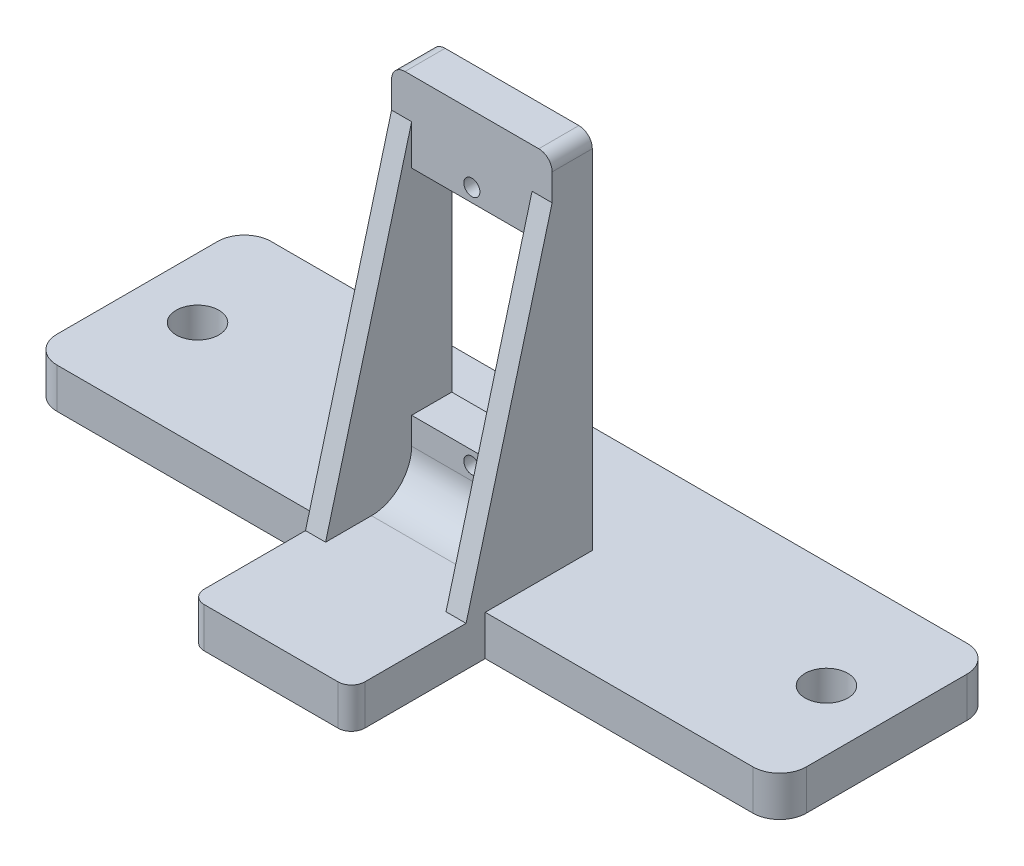
ISO-10303-21;
HEADER;
FILE_DESCRIPTION(('STEP AP214'),'2;1');
FILE_NAME('part.step','',(''),(''),'','','');
FILE_SCHEMA(('AUTOMOTIVE_DESIGN { 1 0 10303 214 1 1 1 1 }'));
ENDSEC;
DATA;
#1=APPLICATION_CONTEXT('core data for automotive mechanical design processes');
#2=APPLICATION_PROTOCOL_DEFINITION('international standard','automotive_design',2000,#1);
#3=PRODUCT_CONTEXT('',#1,'mechanical');
#4=PRODUCT('Part','Part','',(#3));
#5=PRODUCT_RELATED_PRODUCT_CATEGORY('part','',(#4));
#6=PRODUCT_DEFINITION_FORMATION('','',#4);
#7=PRODUCT_DEFINITION_CONTEXT('part definition',#1,'design');
#8=PRODUCT_DEFINITION('design','',#6,#7);
#9=PRODUCT_DEFINITION_SHAPE('','',#8);
#10=(LENGTH_UNIT() NAMED_UNIT(*) SI_UNIT(.MILLI.,.METRE.));
#11=(NAMED_UNIT(*) PLANE_ANGLE_UNIT() SI_UNIT($,.RADIAN.));
#12=(NAMED_UNIT(*) SI_UNIT($,.STERADIAN.) SOLID_ANGLE_UNIT());
#13=UNCERTAINTY_MEASURE_WITH_UNIT(LENGTH_MEASURE(1.E-05),#10,'distance_accuracy_value','');
#14=(GEOMETRIC_REPRESENTATION_CONTEXT(3) GLOBAL_UNCERTAINTY_ASSIGNED_CONTEXT((#13)) GLOBAL_UNIT_ASSIGNED_CONTEXT((#10,
#11,#12)) REPRESENTATION_CONTEXT('',''));
#15=CARTESIAN_POINT('',(0.,0.,0.));
#16=DIRECTION('',(0.,0.,1.));
#17=DIRECTION('',(1.,0.,0.));
#18=AXIS2_PLACEMENT_3D('',#15,#16,#17);
#19=CARTESIAN_POINT('',(5.,29.,3.));
#20=DIRECTION('',(0.,0.,1.));
#21=DIRECTION('',(1.,0.,0.));
#22=AXIS2_PLACEMENT_3D('',#19,#20,#21);
#23=PLANE('',#22);
#24=CARTESIAN_POINT('',(0.,7.,3.));
#25=DIRECTION('',(0.,0.,1.));
#26=DIRECTION('',(1.,0.,0.));
#27=AXIS2_PLACEMENT_3D('',#24,#25,#26);
#28=CIRCLE('',#27,0.6);
#29=CARTESIAN_POINT('',(0.6,7.,3.));
#30=VERTEX_POINT('',#29);
#31=EDGE_CURVE('E280',#30,#30,#28,.T.);
#32=ORIENTED_EDGE('',*,*,#31,.F.);
#33=EDGE_LOOP('',(#32));
#34=FACE_BOUND('',#33,.T.);
#35=DIRECTION('',(0.,-1.,0.));
#36=VECTOR('',#35,1.);
#37=CARTESIAN_POINT('',(-4.5,27.,3.));
#38=LINE('',#37,#36);
#39=CARTESIAN_POINT('',(-4.5,8.,3.));
#40=VERTEX_POINT('',#39);
#41=CARTESIAN_POINT('',(-4.5,6.,3.));
#42=VERTEX_POINT('',#41);
#43=EDGE_CURVE('E244',#40,#42,#38,.T.);
#44=ORIENTED_EDGE('',*,*,#43,.T.);
#45=DIRECTION('',(1.,0.,0.));
#46=VECTOR('',#45,1.);
#47=CARTESIAN_POINT('',(-8.74264068711929,6.,3.));
#48=LINE('',#47,#46);
#49=CARTESIAN_POINT('',(4.49999999999999,6.,3.));
#50=VERTEX_POINT('',#49);
#51=EDGE_CURVE('E57',#42,#50,#48,.T.);
#52=ORIENTED_EDGE('',*,*,#51,.T.);
#53=DIRECTION('',(0.,1.,0.));
#54=VECTOR('',#53,1.);
#55=CARTESIAN_POINT('',(4.49999999999999,27.,3.));
#56=LINE('',#55,#54);
#57=CARTESIAN_POINT('',(4.49999999999999,8.,3.));
#58=VERTEX_POINT('',#57);
#59=EDGE_CURVE('E242',#50,#58,#56,.T.);
#60=ORIENTED_EDGE('',*,*,#59,.T.);
#61=DIRECTION('',(1.,0.,0.));
#62=VECTOR('',#61,1.);
#63=CARTESIAN_POINT('',(-4.5,8.,3.));
#64=LINE('',#63,#62);
#65=EDGE_CURVE('E292',#40,#58,#64,.T.);
#66=ORIENTED_EDGE('',*,*,#65,.F.);
#67=EDGE_LOOP('',(#44,#52,#60,#66));
#68=FACE_BOUND('',#67,.T.);
#69=ADVANCED_FACE('F41',(#34,#68),#23,.T.);
#70=CARTESIAN_POINT('',(0.,3.,0.));
#71=DIRECTION('',(0.,-1.,0.));
#72=DIRECTION('',(0.,0.,-1.));
#73=AXIS2_PLACEMENT_3D('',#70,#71,#72);
#74=PLANE('',#73);
#75=DIRECTION('',(1.,0.,0.));
#76=VECTOR('',#75,1.);
#77=CARTESIAN_POINT('',(-8.74264068711929,3.,6.));
#78=LINE('',#77,#76);
#79=CARTESIAN_POINT('',(-4.5,3.,6.));
#80=VERTEX_POINT('',#79);
#81=CARTESIAN_POINT('',(4.49999999999999,3.,6.));
#82=VERTEX_POINT('',#81);
#83=EDGE_CURVE('E233',#80,#82,#78,.T.);
#84=ORIENTED_EDGE('',*,*,#83,.F.);
#85=DIRECTION('',(0.,0.,1.));
#86=VECTOR('',#85,1.);
#87=CARTESIAN_POINT('',(-4.5,3.,3.));
#88=LINE('',#87,#86);
#89=CARTESIAN_POINT('',(-4.5,3.,9.43078061834678));
#90=VERTEX_POINT('',#89);
#91=EDGE_CURVE('E637',#80,#90,#88,.T.);
#92=ORIENTED_EDGE('',*,*,#91,.T.);
#93=DIRECTION('',(-1.,0.,0.));
#94=VECTOR('',#93,1.);
#95=CARTESIAN_POINT('',(20.3466283298419,3.,9.43078061834678));
#96=LINE('',#95,#94);
#97=CARTESIAN_POINT('',(-6.,3.,9.43078061834678));
#98=VERTEX_POINT('',#97);
#99=EDGE_CURVE('E632',#90,#98,#96,.T.);
#100=ORIENTED_EDGE('',*,*,#99,.T.);
#101=DIRECTION('',(0.,0.,1.));
#102=VECTOR('',#101,1.);
#103=CARTESIAN_POINT('',(-6.,3.,0.));
#104=LINE('',#103,#102);
#105=CARTESIAN_POINT('',(-6.,3.,17.));
#106=VERTEX_POINT('',#105);
#107=EDGE_CURVE('E399',#98,#106,#104,.T.);
#108=ORIENTED_EDGE('',*,*,#107,.T.);
#109=CARTESIAN_POINT('',(-5.,3.,17.));
#110=DIRECTION('',(0.,1.,0.));
#111=DIRECTION('',(0.,0.,1.));
#112=AXIS2_PLACEMENT_3D('',#109,#110,#111);
#113=CIRCLE('',#112,0.999999999999997);
#114=CARTESIAN_POINT('',(-5.,3.,18.));
#115=VERTEX_POINT('',#114);
#116=EDGE_CURVE('E395',#106,#115,#113,.T.);
#117=ORIENTED_EDGE('',*,*,#116,.T.);
#118=DIRECTION('',(1.,0.,0.));
#119=VECTOR('',#118,1.);
#120=CARTESIAN_POINT('',(0.,3.,18.));
#121=LINE('',#120,#119);
#122=CARTESIAN_POINT('',(5.,3.,18.));
#123=VERTEX_POINT('',#122);
#124=EDGE_CURVE('E390',#115,#123,#121,.T.);
#125=ORIENTED_EDGE('',*,*,#124,.T.);
#126=CARTESIAN_POINT('',(5.,3.,17.));
#127=DIRECTION('',(0.,1.,0.));
#128=DIRECTION('',(0.,0.,1.));
#129=AXIS2_PLACEMENT_3D('',#126,#127,#128);
#130=CIRCLE('',#129,0.999999999999997);
#131=CARTESIAN_POINT('',(6.,3.,17.));
#132=VERTEX_POINT('',#131);
#133=EDGE_CURVE('E385',#132,#123,#130,.F.);
#134=ORIENTED_EDGE('',*,*,#133,.F.);
#135=DIRECTION('',(0.,0.,1.));
#136=VECTOR('',#135,1.);
#137=CARTESIAN_POINT('',(6.,3.,0.));
#138=LINE('',#137,#136);
#139=CARTESIAN_POINT('',(6.,3.,9.43078061834678));
#140=VERTEX_POINT('',#139);
#141=EDGE_CURVE('E380',#140,#132,#138,.T.);
#142=ORIENTED_EDGE('',*,*,#141,.F.);
#143=DIRECTION('',(1.,0.,0.));
#144=VECTOR('',#143,1.);
#145=CARTESIAN_POINT('',(-20.346628329842,3.,9.43078061834678));
#146=LINE('',#145,#144);
#147=CARTESIAN_POINT('',(4.49999999999999,3.,9.43078061834678));
#148=VERTEX_POINT('',#147);
#149=EDGE_CURVE('E269',#148,#140,#146,.T.);
#150=ORIENTED_EDGE('',*,*,#149,.F.);
#151=DIRECTION('',(0.,0.,-1.));
#152=VECTOR('',#151,1.);
#153=CARTESIAN_POINT('',(4.49999999999999,3.,3.));
#154=LINE('',#153,#152);
#155=EDGE_CURVE('E262',#148,#82,#154,.T.);
#156=ORIENTED_EDGE('',*,*,#155,.T.);
#157=EDGE_LOOP('',(#84,#92,#100,#108,#117,#125,#134,#142,#150,#156));
#158=FACE_BOUND('',#157,.T.);
#159=ADVANCED_FACE('F629',(#158),#74,.F.);
#160=CARTESIAN_POINT('',(4.49999999999999,8.,3.));
#161=DIRECTION('',(-1.,0.,0.));
#162=DIRECTION('',(0.,-1.,0.));
#163=AXIS2_PLACEMENT_3D('',#160,#161,#162);
#164=PLANE('',#163);
#165=ORIENTED_EDGE('',*,*,#59,.F.);
#166=CARTESIAN_POINT('',(4.49999999999999,6.,6.));
#167=DIRECTION('',(1.,0.,0.));
#168=DIRECTION('',(0.,-1.,0.));
#169=AXIS2_PLACEMENT_3D('',#166,#167,#168);
#170=CIRCLE('',#169,3.);
#171=EDGE_CURVE('E230',#82,#50,#170,.T.);
#172=ORIENTED_EDGE('',*,*,#171,.F.);
#173=ORIENTED_EDGE('',*,*,#155,.F.);
#174=DIRECTION('',(0.,-0.96592582628907,0.258819045102514));
#175=VECTOR('',#174,1.);
#176=CARTESIAN_POINT('',(4.49999999999999,27.,3.));
#177=LINE('',#176,#175);
#178=CARTESIAN_POINT('',(4.49999999999999,27.,3.));
#179=VERTEX_POINT('',#178);
#180=EDGE_CURVE('E265',#179,#148,#177,.T.);
#181=ORIENTED_EDGE('',*,*,#180,.F.);
#182=CARTESIAN_POINT('',(4.5,24.,3.));
#183=VERTEX_POINT('',#182);
#184=EDGE_CURVE('E254',#183,#179,#56,.T.);
#185=ORIENTED_EDGE('',*,*,#184,.F.);
#186=DIRECTION('',(0.,0.,-1.));
#187=VECTOR('',#186,1.);
#188=CARTESIAN_POINT('',(4.5,24.,3.));
#189=LINE('',#188,#187);
#190=CARTESIAN_POINT('',(4.5,24.,0.));
#191=VERTEX_POINT('',#190);
#192=EDGE_CURVE('E318',#183,#191,#189,.T.);
#193=ORIENTED_EDGE('',*,*,#192,.T.);
#194=DIRECTION('',(0.,1.,0.));
#195=VECTOR('',#194,1.);
#196=CARTESIAN_POINT('',(4.49999999999999,8.,0.));
#197=LINE('',#196,#195);
#198=CARTESIAN_POINT('',(4.49999999999999,8.,0.));
#199=VERTEX_POINT('',#198);
#200=EDGE_CURVE('E284',#199,#191,#197,.T.);
#201=ORIENTED_EDGE('',*,*,#200,.F.);
#202=DIRECTION('',(0.,0.,-1.));
#203=VECTOR('',#202,1.);
#204=CARTESIAN_POINT('',(4.49999999999999,8.,3.));
#205=LINE('',#204,#203);
#206=EDGE_CURVE('E251',#58,#199,#205,.T.);
#207=ORIENTED_EDGE('',*,*,#206,.F.);
#208=EDGE_LOOP('',(#165,#172,#173,#181,#185,#193,#201,#207));
#209=FACE_BOUND('',#208,.T.);
#210=ADVANCED_FACE('F249',(#209),#164,.T.);
#211=CARTESIAN_POINT('',(-4.5,8.,3.));
#212=DIRECTION('',(1.,0.,0.));
#213=DIRECTION('',(0.,0.,-1.));
#214=AXIS2_PLACEMENT_3D('',#211,#212,#213);
#215=PLANE('',#214);
#216=ORIENTED_EDGE('',*,*,#91,.F.);
#217=CARTESIAN_POINT('',(-4.5,6.,6.));
#218=DIRECTION('',(1.,0.,0.));
#219=DIRECTION('',(0.,0.,-1.));
#220=AXIS2_PLACEMENT_3D('',#217,#218,#219);
#221=CIRCLE('',#220,3.);
#222=EDGE_CURVE('E246',#42,#80,#221,.F.);
#223=ORIENTED_EDGE('',*,*,#222,.F.);
#224=ORIENTED_EDGE('',*,*,#43,.F.);
#225=DIRECTION('',(0.,0.,-1.));
#226=VECTOR('',#225,1.);
#227=CARTESIAN_POINT('',(-4.5,8.,3.));
#228=LINE('',#227,#226);
#229=CARTESIAN_POINT('',(-4.5,8.,0.));
#230=VERTEX_POINT('',#229);
#231=EDGE_CURVE('E312',#40,#230,#228,.T.);
#232=ORIENTED_EDGE('',*,*,#231,.T.);
#233=DIRECTION('',(0.,-1.,0.));
#234=VECTOR('',#233,1.);
#235=CARTESIAN_POINT('',(-4.5,8.,0.));
#236=LINE('',#235,#234);
#237=CARTESIAN_POINT('',(-4.5,24.,0.));
#238=VERTEX_POINT('',#237);
#239=EDGE_CURVE('E303',#238,#230,#236,.T.);
#240=ORIENTED_EDGE('',*,*,#239,.F.);
#241=DIRECTION('',(0.,0.,-1.));
#242=VECTOR('',#241,1.);
#243=CARTESIAN_POINT('',(-4.5,24.,3.));
#244=LINE('',#243,#242);
#245=CARTESIAN_POINT('',(-4.5,24.,3.));
#246=VERTEX_POINT('',#245);
#247=EDGE_CURVE('E315',#246,#238,#244,.T.);
#248=ORIENTED_EDGE('',*,*,#247,.F.);
#249=CARTESIAN_POINT('',(-4.5,27.,3.));
#250=VERTEX_POINT('',#249);
#251=EDGE_CURVE('E626',#250,#246,#38,.T.);
#252=ORIENTED_EDGE('',*,*,#251,.F.);
#253=DIRECTION('',(0.,0.96592582628907,-0.258819045102514));
#254=VECTOR('',#253,1.);
#255=CARTESIAN_POINT('',(-4.5,27.,3.));
#256=LINE('',#255,#254);
#257=EDGE_CURVE('E943',#90,#250,#256,.T.);
#258=ORIENTED_EDGE('',*,*,#257,.F.);
#259=EDGE_LOOP('',(#216,#223,#224,#232,#240,#248,#252,#258));
#260=FACE_BOUND('',#259,.T.);
#261=ADVANCED_FACE('F810',(#260),#215,.T.);
#262=CARTESIAN_POINT('',(-23.5,3.,0.));
#263=DIRECTION('',(0.,1.,0.));
#264=DIRECTION('',(0.,0.,1.));
#265=AXIS2_PLACEMENT_3D('',#262,#263,#264);
#266=CIRCLE('',#265,1.6);
#267=CARTESIAN_POINT('',(-23.5,3.,1.6));
#268=VERTEX_POINT('',#267);
#269=EDGE_CURVE('E437',#268,#268,#266,.T.);
#270=ORIENTED_EDGE('',*,*,#269,.F.);
#271=EDGE_LOOP('',(#270));
#272=FACE_BOUND('',#271,.T.);
#273=CARTESIAN_POINT('',(23.5,3.,0.));
#274=DIRECTION('',(0.,1.,0.));
#275=DIRECTION('',(0.,0.,1.));
#276=AXIS2_PLACEMENT_3D('',#273,#274,#275);
#277=CIRCLE('',#276,1.6);
#278=CARTESIAN_POINT('',(23.5,3.,1.6));
#279=VERTEX_POINT('',#278);
#280=EDGE_CURVE('E438',#279,#279,#277,.T.);
#281=ORIENTED_EDGE('',*,*,#280,.F.);
#282=EDGE_LOOP('',(#281));
#283=FACE_BOUND('',#282,.T.);
#284=DIRECTION('',(1.,0.,0.));
#285=VECTOR('',#284,1.);
#286=CARTESIAN_POINT('',(-28.,3.,8.));
#287=LINE('',#286,#285);
#288=CARTESIAN_POINT('',(-26.,3.,8.));
#289=VERTEX_POINT('',#288);
#290=CARTESIAN_POINT('',(-6.,3.,8.));
#291=VERTEX_POINT('',#290);
#292=EDGE_CURVE('E460',#289,#291,#287,.T.);
#293=ORIENTED_EDGE('',*,*,#292,.T.);
#294=DIRECTION('',(0.,0.,-1.));
#295=VECTOR('',#294,1.);
#296=CARTESIAN_POINT('',(-6.,3.,3.));
#297=LINE('',#296,#295);
#298=CARTESIAN_POINT('',(-6.,3.,0.));
#299=VERTEX_POINT('',#298);
#300=EDGE_CURVE('E339',#291,#299,#297,.T.);
#301=ORIENTED_EDGE('',*,*,#300,.T.);
#302=DIRECTION('',(1.,0.,0.));
#303=VECTOR('',#302,1.);
#304=CARTESIAN_POINT('',(-6.,3.,0.));
#305=LINE('',#304,#303);
#306=CARTESIAN_POINT('',(6.,3.,0.));
#307=VERTEX_POINT('',#306);
#308=EDGE_CURVE('E65',#299,#307,#305,.T.);
#309=ORIENTED_EDGE('',*,*,#308,.T.);
#310=DIRECTION('',(0.,0.,-1.));
#311=VECTOR('',#310,1.);
#312=CARTESIAN_POINT('',(6.,3.,3.));
#313=LINE('',#312,#311);
#314=CARTESIAN_POINT('',(6.,3.,8.));
#315=VERTEX_POINT('',#314);
#316=EDGE_CURVE('E375',#315,#307,#313,.T.);
#317=ORIENTED_EDGE('',*,*,#316,.F.);
#318=CARTESIAN_POINT('',(26.,3.,8.));
#319=VERTEX_POINT('',#318);
#320=EDGE_CURVE('E459',#315,#319,#287,.T.);
#321=ORIENTED_EDGE('',*,*,#320,.T.);
#322=CARTESIAN_POINT('',(26.,3.,6.));
#323=DIRECTION('',(0.,-1.,0.));
#324=DIRECTION('',(0.,0.,-1.));
#325=AXIS2_PLACEMENT_3D('',#322,#323,#324);
#326=CIRCLE('',#325,2.);
#327=CARTESIAN_POINT('',(28.,3.,6.));
#328=VERTEX_POINT('',#327);
#329=EDGE_CURVE('E519',#319,#328,#326,.F.);
#330=ORIENTED_EDGE('',*,*,#329,.T.);
#331=DIRECTION('',(0.,0.,-1.));
#332=VECTOR('',#331,1.);
#333=CARTESIAN_POINT('',(28.,3.,8.));
#334=LINE('',#333,#332);
#335=CARTESIAN_POINT('',(28.,3.,-6.));
#336=VERTEX_POINT('',#335);
#337=EDGE_CURVE('E446',#328,#336,#334,.T.);
#338=ORIENTED_EDGE('',*,*,#337,.T.);
#339=CARTESIAN_POINT('',(26.,3.,-6.));
#340=DIRECTION('',(0.,-1.,0.));
#341=DIRECTION('',(0.,0.,-1.));
#342=AXIS2_PLACEMENT_3D('',#339,#340,#341);
#343=CIRCLE('',#342,2.);
#344=CARTESIAN_POINT('',(26.,3.,-8.));
#345=VERTEX_POINT('',#344);
#346=EDGE_CURVE('E522',#336,#345,#343,.F.);
#347=ORIENTED_EDGE('',*,*,#346,.T.);
#348=DIRECTION('',(-1.,0.,0.));
#349=VECTOR('',#348,1.);
#350=CARTESIAN_POINT('',(-28.,3.,-8.));
#351=LINE('',#350,#349);
#352=CARTESIAN_POINT('',(-26.,3.,-8.));
#353=VERTEX_POINT('',#352);
#354=EDGE_CURVE('E450',#345,#353,#351,.T.);
#355=ORIENTED_EDGE('',*,*,#354,.T.);
#356=CARTESIAN_POINT('',(-26.,3.,-6.));
#357=DIRECTION('',(0.,-1.,0.));
#358=DIRECTION('',(0.,0.,-1.));
#359=AXIS2_PLACEMENT_3D('',#356,#357,#358);
#360=CIRCLE('',#359,2.);
#361=CARTESIAN_POINT('',(-28.,3.,-6.));
#362=VERTEX_POINT('',#361);
#363=EDGE_CURVE('E513',#353,#362,#360,.F.);
#364=ORIENTED_EDGE('',*,*,#363,.T.);
#365=DIRECTION('',(0.,0.,1.));
#366=VECTOR('',#365,1.);
#367=CARTESIAN_POINT('',(-28.,3.,8.));
#368=LINE('',#367,#366);
#369=CARTESIAN_POINT('',(-28.,3.,6.));
#370=VERTEX_POINT('',#369);
#371=EDGE_CURVE('E455',#362,#370,#368,.T.);
#372=ORIENTED_EDGE('',*,*,#371,.T.);
#373=CARTESIAN_POINT('',(-26.,3.,6.));
#374=DIRECTION('',(0.,-1.,0.));
#375=DIRECTION('',(0.,0.,-1.));
#376=AXIS2_PLACEMENT_3D('',#373,#374,#375);
#377=CIRCLE('',#376,2.);
#378=EDGE_CURVE('E516',#370,#289,#377,.F.);
#379=ORIENTED_EDGE('',*,*,#378,.T.);
#380=EDGE_LOOP('',(#293,#301,#309,#317,#321,#330,#338,#347,#355,#364,#372,#379));
#381=FACE_BOUND('',#380,.T.);
#382=ADVANCED_FACE('F555',(#272,#283,#381),#74,.F.);
#383=CARTESIAN_POINT('',(-28.,3.,8.));
#384=DIRECTION('',(0.,0.,-1.));
#385=DIRECTION('',(-1.,0.,0.));
#386=AXIS2_PLACEMENT_3D('',#383,#384,#385);
#387=PLANE('',#386);
#388=DIRECTION('',(0.,1.,0.));
#389=VECTOR('',#388,1.);
#390=CARTESIAN_POINT('',(6.,-15.6204993518133,8.));
#391=LINE('',#390,#389);
#392=CARTESIAN_POINT('',(6.,0.,8.));
#393=VERTEX_POINT('',#392);
#394=EDGE_CURVE('E384',#393,#315,#391,.T.);
#395=ORIENTED_EDGE('',*,*,#394,.F.);
#396=DIRECTION('',(1.,0.,0.));
#397=VECTOR('',#396,1.);
#398=CARTESIAN_POINT('',(-28.,0.,8.));
#399=LINE('',#398,#397);
#400=CARTESIAN_POINT('',(26.,0.,8.));
#401=VERTEX_POINT('',#400);
#402=EDGE_CURVE('E478',#393,#401,#399,.T.);
#403=ORIENTED_EDGE('',*,*,#402,.T.);
#404=DIRECTION('',(0.,-1.,0.));
#405=VECTOR('',#404,1.);
#406=CARTESIAN_POINT('',(26.,3.,8.));
#407=LINE('',#406,#405);
#408=EDGE_CURVE('E529',#401,#319,#407,.F.);
#409=ORIENTED_EDGE('',*,*,#408,.T.);
#410=ORIENTED_EDGE('',*,*,#320,.F.);
#411=EDGE_LOOP('',(#395,#403,#409,#410));
#412=FACE_BOUND('',#411,.T.);
#413=ADVANCED_FACE('F580',(#412),#387,.F.);
#414=CARTESIAN_POINT('',(28.,3.,8.));
#415=DIRECTION('',(-1.,0.,0.));
#416=DIRECTION('',(0.,0.,1.));
#417=AXIS2_PLACEMENT_3D('',#414,#415,#416);
#418=PLANE('',#417);
#419=DIRECTION('',(0.,0.,-1.));
#420=VECTOR('',#419,1.);
#421=CARTESIAN_POINT('',(28.,0.,8.));
#422=LINE('',#421,#420);
#423=CARTESIAN_POINT('',(28.,0.,6.));
#424=VERTEX_POINT('',#423);
#425=CARTESIAN_POINT('',(28.,0.,-6.));
#426=VERTEX_POINT('',#425);
#427=EDGE_CURVE('E465',#424,#426,#422,.T.);
#428=ORIENTED_EDGE('',*,*,#427,.T.);
#429=DIRECTION('',(0.,-1.,0.));
#430=VECTOR('',#429,1.);
#431=CARTESIAN_POINT('',(28.,3.,-6.));
#432=LINE('',#431,#430);
#433=EDGE_CURVE('E510',#426,#336,#432,.F.);
#434=ORIENTED_EDGE('',*,*,#433,.T.);
#435=ORIENTED_EDGE('',*,*,#337,.F.);
#436=DIRECTION('',(0.,-1.,0.));
#437=VECTOR('',#436,1.);
#438=CARTESIAN_POINT('',(28.,3.,6.));
#439=LINE('',#438,#437);
#440=EDGE_CURVE('E506',#328,#424,#439,.T.);
#441=ORIENTED_EDGE('',*,*,#440,.T.);
#442=EDGE_LOOP('',(#428,#434,#435,#441));
#443=FACE_BOUND('',#442,.T.);
#444=ADVANCED_FACE('F565',(#443),#418,.F.);
#445=CARTESIAN_POINT('',(-28.,3.,-8.));
#446=DIRECTION('',(0.,0.,1.));
#447=DIRECTION('',(1.,0.,0.));
#448=AXIS2_PLACEMENT_3D('',#445,#446,#447);
#449=PLANE('',#448);
#450=ORIENTED_EDGE('',*,*,#354,.F.);
#451=DIRECTION('',(0.,-1.,0.));
#452=VECTOR('',#451,1.);
#453=CARTESIAN_POINT('',(26.,3.,-8.));
#454=LINE('',#453,#452);
#455=CARTESIAN_POINT('',(26.,0.,-8.));
#456=VERTEX_POINT('',#455);
#457=EDGE_CURVE('E489',#345,#456,#454,.T.);
#458=ORIENTED_EDGE('',*,*,#457,.T.);
#459=DIRECTION('',(-1.,0.,0.));
#460=VECTOR('',#459,1.);
#461=CARTESIAN_POINT('',(-28.,0.,-8.));
#462=LINE('',#461,#460);
#463=CARTESIAN_POINT('',(-26.,0.,-8.));
#464=VERTEX_POINT('',#463);
#465=EDGE_CURVE('E469',#456,#464,#462,.T.);
#466=ORIENTED_EDGE('',*,*,#465,.T.);
#467=DIRECTION('',(0.,-1.,0.));
#468=VECTOR('',#467,1.);
#469=CARTESIAN_POINT('',(-26.,3.,-8.));
#470=LINE('',#469,#468);
#471=EDGE_CURVE('E464',#464,#353,#470,.F.);
#472=ORIENTED_EDGE('',*,*,#471,.T.);
#473=EDGE_LOOP('',(#450,#458,#466,#472));
#474=FACE_BOUND('',#473,.T.);
#475=ADVANCED_FACE('F559',(#474),#449,.F.);
#476=CARTESIAN_POINT('',(-28.,3.,8.));
#477=DIRECTION('',(1.,0.,0.));
#478=DIRECTION('',(0.,0.,-1.));
#479=AXIS2_PLACEMENT_3D('',#476,#477,#478);
#480=PLANE('',#479);
#481=DIRECTION('',(0.,0.,1.));
#482=VECTOR('',#481,1.);
#483=CARTESIAN_POINT('',(-28.,0.,8.));
#484=LINE('',#483,#482);
#485=CARTESIAN_POINT('',(-28.,0.,-6.));
#486=VERTEX_POINT('',#485);
#487=CARTESIAN_POINT('',(-28.,0.,6.));
#488=VERTEX_POINT('',#487);
#489=EDGE_CURVE('E474',#486,#488,#484,.T.);
#490=ORIENTED_EDGE('',*,*,#489,.T.);
#491=DIRECTION('',(0.,-1.,0.));
#492=VECTOR('',#491,1.);
#493=CARTESIAN_POINT('',(-28.,3.,6.));
#494=LINE('',#493,#492);
#495=EDGE_CURVE('E11',#488,#370,#494,.F.);
#496=ORIENTED_EDGE('',*,*,#495,.T.);
#497=ORIENTED_EDGE('',*,*,#371,.F.);
#498=DIRECTION('',(0.,-1.,0.));
#499=VECTOR('',#498,1.);
#500=CARTESIAN_POINT('',(-28.,3.,-6.));
#501=LINE('',#500,#499);
#502=EDGE_CURVE('E50',#362,#486,#501,.T.);
#503=ORIENTED_EDGE('',*,*,#502,.T.);
#504=EDGE_LOOP('',(#490,#496,#497,#503));
#505=FACE_BOUND('',#504,.T.);
#506=ADVANCED_FACE('F538',(#505),#480,.F.);
#507=CARTESIAN_POINT('',(-26.,0.,8.));
#508=VERTEX_POINT('',#507);
#509=CARTESIAN_POINT('',(-6.,0.,8.));
#510=VERTEX_POINT('',#509);
#511=EDGE_CURVE('E451',#508,#510,#399,.T.);
#512=ORIENTED_EDGE('',*,*,#511,.T.);
#513=DIRECTION('',(0.,1.,0.));
#514=VECTOR('',#513,1.);
#515=CARTESIAN_POINT('',(-6.,-15.6204993518133,8.));
#516=LINE('',#515,#514);
#517=EDGE_CURVE('E383',#510,#291,#516,.T.);
#518=ORIENTED_EDGE('',*,*,#517,.T.);
#519=ORIENTED_EDGE('',*,*,#292,.F.);
#520=DIRECTION('',(0.,-1.,0.));
#521=VECTOR('',#520,1.);
#522=CARTESIAN_POINT('',(-26.,3.,8.));
#523=LINE('',#522,#521);
#524=EDGE_CURVE('E525',#289,#508,#523,.T.);
#525=ORIENTED_EDGE('',*,*,#524,.T.);
#526=EDGE_LOOP('',(#512,#518,#519,#525));
#527=FACE_BOUND('',#526,.T.);
#528=ADVANCED_FACE('F553',(#527),#387,.F.);
#529=CARTESIAN_POINT('',(0.,0.,0.));
#530=DIRECTION('',(0.,-1.,0.));
#531=DIRECTION('',(0.,0.,-1.));
#532=AXIS2_PLACEMENT_3D('',#529,#530,#531);
#533=PLANE('',#532);
#534=CARTESIAN_POINT('',(23.5,0.,0.));
#535=DIRECTION('',(0.,-1.,0.));
#536=DIRECTION('',(0.,0.,-1.));
#537=AXIS2_PLACEMENT_3D('',#534,#535,#536);
#538=CIRCLE('',#537,1.6);
#539=CARTESIAN_POINT('',(23.5,0.,-1.6));
#540=VERTEX_POINT('',#539);
#541=EDGE_CURVE('E470',#540,#540,#538,.T.);
#542=ORIENTED_EDGE('',*,*,#541,.F.);
#543=EDGE_LOOP('',(#542));
#544=FACE_BOUND('',#543,.T.);
#545=CARTESIAN_POINT('',(-23.5,0.,0.));
#546=DIRECTION('',(0.,-1.,0.));
#547=DIRECTION('',(0.,0.,-1.));
#548=AXIS2_PLACEMENT_3D('',#545,#546,#547);
#549=CIRCLE('',#548,1.6);
#550=CARTESIAN_POINT('',(-23.5,0.,-1.6));
#551=VERTEX_POINT('',#550);
#552=EDGE_CURVE('E442',#551,#551,#549,.T.);
#553=ORIENTED_EDGE('',*,*,#552,.F.);
#554=EDGE_LOOP('',(#553));
#555=FACE_BOUND('',#554,.T.);
#556=ORIENTED_EDGE('',*,*,#465,.F.);
#557=CARTESIAN_POINT('',(26.,0.,-6.));
#558=DIRECTION('',(0.,-1.,0.));
#559=DIRECTION('',(0.,0.,-1.));
#560=AXIS2_PLACEMENT_3D('',#557,#558,#559);
#561=CIRCLE('',#560,2.);
#562=EDGE_CURVE('E503',#456,#426,#561,.T.);
#563=ORIENTED_EDGE('',*,*,#562,.T.);
#564=ORIENTED_EDGE('',*,*,#427,.F.);
#565=CARTESIAN_POINT('',(26.,0.,6.));
#566=DIRECTION('',(0.,-1.,0.));
#567=DIRECTION('',(0.,0.,-1.));
#568=AXIS2_PLACEMENT_3D('',#565,#566,#567);
#569=CIRCLE('',#568,2.);
#570=EDGE_CURVE('E499',#424,#401,#569,.T.);
#571=ORIENTED_EDGE('',*,*,#570,.T.);
#572=ORIENTED_EDGE('',*,*,#402,.F.);
#573=DIRECTION('',(0.,0.,1.));
#574=VECTOR('',#573,1.);
#575=CARTESIAN_POINT('',(6.,0.,0.));
#576=LINE('',#575,#574);
#577=CARTESIAN_POINT('',(6.,0.,17.));
#578=VERTEX_POINT('',#577);
#579=EDGE_CURVE('E379',#393,#578,#576,.T.);
#580=ORIENTED_EDGE('',*,*,#579,.T.);
#581=CARTESIAN_POINT('',(5.,0.,17.));
#582=DIRECTION('',(0.,-1.,0.));
#583=DIRECTION('',(0.,0.,-1.));
#584=AXIS2_PLACEMENT_3D('',#581,#582,#583);
#585=CIRCLE('',#584,0.999999999999997);
#586=CARTESIAN_POINT('',(5.,0.,18.));
#587=VERTEX_POINT('',#586);
#588=EDGE_CURVE('E402',#578,#587,#585,.T.);
#589=ORIENTED_EDGE('',*,*,#588,.T.);
#590=DIRECTION('',(1.,0.,0.));
#591=VECTOR('',#590,1.);
#592=CARTESIAN_POINT('',(0.,0.,18.));
#593=LINE('',#592,#591);
#594=CARTESIAN_POINT('',(-5.,0.,18.));
#595=VERTEX_POINT('',#594);
#596=EDGE_CURVE('E411',#595,#587,#593,.T.);
#597=ORIENTED_EDGE('',*,*,#596,.F.);
#598=CARTESIAN_POINT('',(-5.,0.,17.));
#599=DIRECTION('',(0.,-1.,0.));
#600=DIRECTION('',(0.,0.,-1.));
#601=AXIS2_PLACEMENT_3D('',#598,#599,#600);
#602=CIRCLE('',#601,0.999999999999997);
#603=CARTESIAN_POINT('',(-6.,0.,17.));
#604=VERTEX_POINT('',#603);
#605=EDGE_CURVE('E417',#604,#595,#602,.F.);
#606=ORIENTED_EDGE('',*,*,#605,.F.);
#607=DIRECTION('',(0.,0.,1.));
#608=VECTOR('',#607,1.);
#609=CARTESIAN_POINT('',(-6.,0.,0.));
#610=LINE('',#609,#608);
#611=EDGE_CURVE('E394',#510,#604,#610,.T.);
#612=ORIENTED_EDGE('',*,*,#611,.F.);
#613=ORIENTED_EDGE('',*,*,#511,.F.);
#614=CARTESIAN_POINT('',(-26.,0.,6.));
#615=DIRECTION('',(0.,-1.,0.));
#616=DIRECTION('',(0.,0.,-1.));
#617=AXIS2_PLACEMENT_3D('',#614,#615,#616);
#618=CIRCLE('',#617,2.);
#619=EDGE_CURVE('E496',#508,#488,#618,.T.);
#620=ORIENTED_EDGE('',*,*,#619,.T.);
#621=ORIENTED_EDGE('',*,*,#489,.F.);
#622=CARTESIAN_POINT('',(-26.,0.,-6.));
#623=DIRECTION('',(0.,-1.,0.));
#624=DIRECTION('',(0.,0.,-1.));
#625=AXIS2_PLACEMENT_3D('',#622,#623,#624);
#626=CIRCLE('',#625,2.);
#627=EDGE_CURVE('E493',#486,#464,#626,.T.);
#628=ORIENTED_EDGE('',*,*,#627,.T.);
#629=EDGE_LOOP('',(#556,#563,#564,#571,#572,#580,#589,#597,#606,#612,#613,#620,#621,#628));
#630=FACE_BOUND('',#629,.T.);
#631=ADVANCED_FACE('F544',(#544,#555,#630),#533,.T.);
#632=CARTESIAN_POINT('',(-23.5,-2.,0.));
#633=DIRECTION('',(0.,1.,0.));
#634=DIRECTION('',(0.,0.,1.));
#635=AXIS2_PLACEMENT_3D('',#632,#633,#634);
#636=CYLINDRICAL_SURFACE('',#635,1.6);
#637=ORIENTED_EDGE('',*,*,#552,.T.);
#638=EDGE_LOOP('',(#637));
#639=FACE_BOUND('',#638,.T.);
#640=ORIENTED_EDGE('',*,*,#269,.T.);
#641=EDGE_LOOP('',(#640));
#642=FACE_BOUND('',#641,.T.);
#643=ADVANCED_FACE('F685',(#639,#642),#636,.F.);
#644=CARTESIAN_POINT('',(23.5,-2.,0.));
#645=DIRECTION('',(0.,1.,0.));
#646=DIRECTION('',(0.,0.,1.));
#647=AXIS2_PLACEMENT_3D('',#644,#645,#646);
#648=CYLINDRICAL_SURFACE('',#647,1.6);
#649=ORIENTED_EDGE('',*,*,#541,.T.);
#650=EDGE_LOOP('',(#649));
#651=FACE_BOUND('',#650,.T.);
#652=ORIENTED_EDGE('',*,*,#280,.T.);
#653=EDGE_LOOP('',(#652));
#654=FACE_BOUND('',#653,.T.);
#655=ADVANCED_FACE('F682',(#651,#654),#648,.F.);
#656=CARTESIAN_POINT('',(26.,3.,-6.));
#657=DIRECTION('',(0.,-1.,0.));
#658=DIRECTION('',(0.,0.,-1.));
#659=AXIS2_PLACEMENT_3D('',#656,#657,#658);
#660=CYLINDRICAL_SURFACE('',#659,2.);
#661=ORIENTED_EDGE('',*,*,#346,.F.);
#662=ORIENTED_EDGE('',*,*,#433,.F.);
#663=ORIENTED_EDGE('',*,*,#562,.F.);
#664=ORIENTED_EDGE('',*,*,#457,.F.);
#665=EDGE_LOOP('',(#661,#662,#663,#664));
#666=FACE_BOUND('',#665,.T.);
#667=ADVANCED_FACE('F569',(#666),#660,.T.);
#668=CARTESIAN_POINT('',(26.,3.,6.));
#669=DIRECTION('',(0.,-1.,0.));
#670=DIRECTION('',(0.,0.,-1.));
#671=AXIS2_PLACEMENT_3D('',#668,#669,#670);
#672=CYLINDRICAL_SURFACE('',#671,2.);
#673=ORIENTED_EDGE('',*,*,#329,.F.);
#674=ORIENTED_EDGE('',*,*,#408,.F.);
#675=ORIENTED_EDGE('',*,*,#570,.F.);
#676=ORIENTED_EDGE('',*,*,#440,.F.);
#677=EDGE_LOOP('',(#673,#674,#675,#676));
#678=FACE_BOUND('',#677,.T.);
#679=ADVANCED_FACE('F572',(#678),#672,.T.);
#680=CARTESIAN_POINT('',(-26.,3.,6.));
#681=DIRECTION('',(0.,-1.,0.));
#682=DIRECTION('',(0.,0.,-1.));
#683=AXIS2_PLACEMENT_3D('',#680,#681,#682);
#684=CYLINDRICAL_SURFACE('',#683,2.);
#685=ORIENTED_EDGE('',*,*,#378,.F.);
#686=ORIENTED_EDGE('',*,*,#495,.F.);
#687=ORIENTED_EDGE('',*,*,#619,.F.);
#688=ORIENTED_EDGE('',*,*,#524,.F.);
#689=EDGE_LOOP('',(#685,#686,#687,#688));
#690=FACE_BOUND('',#689,.T.);
#691=ADVANCED_FACE('F550',(#690),#684,.T.);
#692=CARTESIAN_POINT('',(-26.,3.,-6.));
#693=DIRECTION('',(0.,-1.,0.));
#694=DIRECTION('',(0.,0.,-1.));
#695=AXIS2_PLACEMENT_3D('',#692,#693,#694);
#696=CYLINDRICAL_SURFACE('',#695,2.);
#697=ORIENTED_EDGE('',*,*,#363,.F.);
#698=ORIENTED_EDGE('',*,*,#471,.F.);
#699=ORIENTED_EDGE('',*,*,#627,.F.);
#700=ORIENTED_EDGE('',*,*,#502,.F.);
#701=EDGE_LOOP('',(#697,#698,#699,#700));
#702=FACE_BOUND('',#701,.T.);
#703=ADVANCED_FACE('F43',(#702),#696,.T.);
#704=CARTESIAN_POINT('',(-6.,-15.6204993518133,0.));
#705=DIRECTION('',(-1.,0.,0.));
#706=DIRECTION('',(0.,0.,1.));
#707=AXIS2_PLACEMENT_3D('',#704,#705,#706);
#708=PLANE('',#707);
#709=ORIENTED_EDGE('',*,*,#517,.F.);
#710=ORIENTED_EDGE('',*,*,#611,.T.);
#711=DIRECTION('',(0.,1.,0.));
#712=VECTOR('',#711,1.);
#713=CARTESIAN_POINT('',(-6.,-15.6204993518133,17.));
#714=LINE('',#713,#712);
#715=EDGE_CURVE('E406',#604,#106,#714,.T.);
#716=ORIENTED_EDGE('',*,*,#715,.T.);
#717=ORIENTED_EDGE('',*,*,#107,.F.);
#718=DIRECTION('',(0.,0.96592582628907,-0.258819045102514));
#719=VECTOR('',#718,1.);
#720=CARTESIAN_POINT('',(-6.,27.,3.));
#721=LINE('',#720,#719);
#722=CARTESIAN_POINT('',(-6.,27.,3.));
#723=VERTEX_POINT('',#722);
#724=EDGE_CURVE('E634',#98,#723,#721,.T.);
#725=ORIENTED_EDGE('',*,*,#724,.T.);
#726=DIRECTION('',(0.,-1.,0.));
#727=VECTOR('',#726,1.);
#728=CARTESIAN_POINT('',(-6.,3.,3.));
#729=LINE('',#728,#727);
#730=CARTESIAN_POINT('',(-6.,29.,3.));
#731=VERTEX_POINT('',#730);
#732=EDGE_CURVE('E335',#731,#723,#729,.T.);
#733=ORIENTED_EDGE('',*,*,#732,.F.);
#734=DIRECTION('',(0.,0.,-1.));
#735=VECTOR('',#734,1.);
#736=CARTESIAN_POINT('',(-6.,29.,3.));
#737=LINE('',#736,#735);
#738=CARTESIAN_POINT('',(-6.,29.,0.));
#739=VERTEX_POINT('',#738);
#740=EDGE_CURVE('E359',#731,#739,#737,.T.);
#741=ORIENTED_EDGE('',*,*,#740,.T.);
#742=DIRECTION('',(0.,-1.,0.));
#743=VECTOR('',#742,1.);
#744=CARTESIAN_POINT('',(-6.,3.,0.));
#745=LINE('',#744,#743);
#746=EDGE_CURVE('E326',#739,#299,#745,.T.);
#747=ORIENTED_EDGE('',*,*,#746,.T.);
#748=ORIENTED_EDGE('',*,*,#300,.F.);
#749=EDGE_LOOP('',(#709,#710,#716,#717,#725,#733,#741,#747,#748));
#750=FACE_BOUND('',#749,.T.);
#751=ADVANCED_FACE('F600',(#750),#708,.T.);
#752=CARTESIAN_POINT('',(-5.,-15.6204993518133,17.));
#753=DIRECTION('',(0.,1.,0.));
#754=DIRECTION('',(0.,0.,1.));
#755=AXIS2_PLACEMENT_3D('',#752,#753,#754);
#756=CYLINDRICAL_SURFACE('',#755,0.999999999999997);
#757=ORIENTED_EDGE('',*,*,#715,.F.);
#758=ORIENTED_EDGE('',*,*,#605,.T.);
#759=DIRECTION('',(0.,1.,0.));
#760=VECTOR('',#759,1.);
#761=CARTESIAN_POINT('',(-5.,-15.6204993518133,18.));
#762=LINE('',#761,#760);
#763=EDGE_CURVE('E416',#595,#115,#762,.T.);
#764=ORIENTED_EDGE('',*,*,#763,.T.);
#765=ORIENTED_EDGE('',*,*,#116,.F.);
#766=EDGE_LOOP('',(#757,#758,#764,#765));
#767=FACE_BOUND('',#766,.T.);
#768=ADVANCED_FACE('F597',(#767),#756,.T.);
#769=CARTESIAN_POINT('',(0.,-15.6204993518133,18.));
#770=DIRECTION('',(0.,0.,1.));
#771=DIRECTION('',(1.,0.,0.));
#772=AXIS2_PLACEMENT_3D('',#769,#770,#771);
#773=PLANE('',#772);
#774=ORIENTED_EDGE('',*,*,#763,.F.);
#775=ORIENTED_EDGE('',*,*,#596,.T.);
#776=DIRECTION('',(0.,1.,0.));
#777=VECTOR('',#776,1.);
#778=CARTESIAN_POINT('',(5.,-15.6204993518133,18.));
#779=LINE('',#778,#777);
#780=EDGE_CURVE('E415',#587,#123,#779,.T.);
#781=ORIENTED_EDGE('',*,*,#780,.T.);
#782=ORIENTED_EDGE('',*,*,#124,.F.);
#783=EDGE_LOOP('',(#774,#775,#781,#782));
#784=FACE_BOUND('',#783,.T.);
#785=ADVANCED_FACE('F594',(#784),#773,.T.);
#786=CARTESIAN_POINT('',(5.,-15.6204993518133,17.));
#787=DIRECTION('',(0.,1.,0.));
#788=DIRECTION('',(0.,0.,1.));
#789=AXIS2_PLACEMENT_3D('',#786,#787,#788);
#790=CYLINDRICAL_SURFACE('',#789,0.999999999999997);
#791=ORIENTED_EDGE('',*,*,#588,.F.);
#792=DIRECTION('',(0.,1.,0.));
#793=VECTOR('',#792,1.);
#794=CARTESIAN_POINT('',(6.,-15.6204993518133,17.));
#795=LINE('',#794,#793);
#796=EDGE_CURVE('E389',#578,#132,#795,.T.);
#797=ORIENTED_EDGE('',*,*,#796,.T.);
#798=ORIENTED_EDGE('',*,*,#133,.T.);
#799=ORIENTED_EDGE('',*,*,#780,.F.);
#800=EDGE_LOOP('',(#791,#797,#798,#799));
#801=FACE_BOUND('',#800,.T.);
#802=ADVANCED_FACE('F589',(#801),#790,.T.);
#803=CARTESIAN_POINT('',(6.,-15.6204993518133,0.));
#804=DIRECTION('',(-1.,0.,0.));
#805=DIRECTION('',(0.,0.,1.));
#806=AXIS2_PLACEMENT_3D('',#803,#804,#805);
#807=PLANE('',#806);
#808=ORIENTED_EDGE('',*,*,#579,.F.);
#809=ORIENTED_EDGE('',*,*,#394,.T.);
#810=ORIENTED_EDGE('',*,*,#316,.T.);
#811=DIRECTION('',(0.,1.,0.));
#812=VECTOR('',#811,1.);
#813=CARTESIAN_POINT('',(6.,3.,0.));
#814=LINE('',#813,#812);
#815=CARTESIAN_POINT('',(6.,29.,0.));
#816=VERTEX_POINT('',#815);
#817=EDGE_CURVE('E342',#307,#816,#814,.T.);
#818=ORIENTED_EDGE('',*,*,#817,.T.);
#819=DIRECTION('',(0.,0.,-1.));
#820=VECTOR('',#819,1.);
#821=CARTESIAN_POINT('',(6.,29.,3.));
#822=LINE('',#821,#820);
#823=CARTESIAN_POINT('',(6.,29.,3.));
#824=VERTEX_POINT('',#823);
#825=EDGE_CURVE('E371',#824,#816,#822,.T.);
#826=ORIENTED_EDGE('',*,*,#825,.F.);
#827=DIRECTION('',(0.,1.,0.));
#828=VECTOR('',#827,1.);
#829=CARTESIAN_POINT('',(6.,3.,3.));
#830=LINE('',#829,#828);
#831=CARTESIAN_POINT('',(6.,27.,3.));
#832=VERTEX_POINT('',#831);
#833=EDGE_CURVE('E322',#832,#824,#830,.T.);
#834=ORIENTED_EDGE('',*,*,#833,.F.);
#835=DIRECTION('',(0.,-0.96592582628907,0.258819045102514));
#836=VECTOR('',#835,1.);
#837=CARTESIAN_POINT('',(6.,27.,3.));
#838=LINE('',#837,#836);
#839=EDGE_CURVE('E623',#832,#140,#838,.T.);
#840=ORIENTED_EDGE('',*,*,#839,.T.);
#841=ORIENTED_EDGE('',*,*,#141,.T.);
#842=ORIENTED_EDGE('',*,*,#796,.F.);
#843=EDGE_LOOP('',(#808,#809,#810,#818,#826,#834,#840,#841,#842));
#844=FACE_BOUND('',#843,.T.);
#845=ADVANCED_FACE('F582',(#844),#807,.F.);
#846=ORIENTED_EDGE('',*,*,#251,.T.);
#847=DIRECTION('',(-1.,0.,0.));
#848=VECTOR('',#847,1.);
#849=CARTESIAN_POINT('',(-4.5,24.,3.));
#850=LINE('',#849,#848);
#851=EDGE_CURVE('E288',#183,#246,#850,.T.);
#852=ORIENTED_EDGE('',*,*,#851,.F.);
#853=ORIENTED_EDGE('',*,*,#184,.T.);
#854=DIRECTION('',(1.,0.,0.));
#855=VECTOR('',#854,1.);
#856=CARTESIAN_POINT('',(-20.346628329842,27.,3.));
#857=LINE('',#856,#855);
#858=EDGE_CURVE('E253',#179,#832,#857,.T.);
#859=ORIENTED_EDGE('',*,*,#858,.T.);
#860=ORIENTED_EDGE('',*,*,#833,.T.);
#861=CARTESIAN_POINT('',(5.,29.,3.));
#862=DIRECTION('',(0.,0.,1.));
#863=DIRECTION('',(1.,0.,0.));
#864=AXIS2_PLACEMENT_3D('',#861,#862,#863);
#865=CIRCLE('',#864,1.);
#866=CARTESIAN_POINT('',(4.99999999999999,30.,3.));
#867=VERTEX_POINT('',#866);
#868=EDGE_CURVE('E325',#824,#867,#865,.T.);
#869=ORIENTED_EDGE('',*,*,#868,.T.);
#870=DIRECTION('',(-1.,0.,0.));
#871=VECTOR('',#870,1.);
#872=CARTESIAN_POINT('',(-4.99999999999999,30.,3.));
#873=LINE('',#872,#871);
#874=CARTESIAN_POINT('',(-4.99999999999999,30.,3.));
#875=VERTEX_POINT('',#874);
#876=EDGE_CURVE('E329',#867,#875,#873,.T.);
#877=ORIENTED_EDGE('',*,*,#876,.T.);
#878=CARTESIAN_POINT('',(-5.,29.,3.));
#879=DIRECTION('',(0.,0.,1.));
#880=DIRECTION('',(-1.,0.,0.));
#881=AXIS2_PLACEMENT_3D('',#878,#879,#880);
#882=CIRCLE('',#881,1.);
#883=EDGE_CURVE('E332',#875,#731,#882,.T.);
#884=ORIENTED_EDGE('',*,*,#883,.T.);
#885=ORIENTED_EDGE('',*,*,#732,.T.);
#886=DIRECTION('',(-1.,0.,0.));
#887=VECTOR('',#886,1.);
#888=CARTESIAN_POINT('',(20.3466283298419,27.,3.));
#889=LINE('',#888,#887);
#890=EDGE_CURVE('E640',#250,#723,#889,.T.);
#891=ORIENTED_EDGE('',*,*,#890,.F.);
#892=EDGE_LOOP('',(#846,#852,#853,#859,#860,#869,#877,#884,#885,#891));
#893=FACE_BOUND('',#892,.T.);
#894=CARTESIAN_POINT('',(0.,25.,3.));
#895=DIRECTION('',(0.,0.,1.));
#896=DIRECTION('',(-1.,0.,0.));
#897=AXIS2_PLACEMENT_3D('',#894,#895,#896);
#898=CIRCLE('',#897,0.6);
#899=CARTESIAN_POINT('',(-0.600000000000002,25.,3.));
#900=VERTEX_POINT('',#899);
#901=EDGE_CURVE('E272',#900,#900,#898,.T.);
#902=ORIENTED_EDGE('',*,*,#901,.F.);
#903=EDGE_LOOP('',(#902));
#904=FACE_BOUND('',#903,.T.);
#905=ADVANCED_FACE('F619',(#893,#904),#23,.T.);
#906=CARTESIAN_POINT('',(5.,29.,0.));
#907=DIRECTION('',(0.,0.,1.));
#908=DIRECTION('',(1.,0.,0.));
#909=AXIS2_PLACEMENT_3D('',#906,#907,#908);
#910=PLANE('',#909);
#911=ORIENTED_EDGE('',*,*,#308,.F.);
#912=ORIENTED_EDGE('',*,*,#746,.F.);
#913=CARTESIAN_POINT('',(-5.,29.,0.));
#914=DIRECTION('',(0.,0.,1.));
#915=DIRECTION('',(-1.,0.,0.));
#916=AXIS2_PLACEMENT_3D('',#913,#914,#915);
#917=CIRCLE('',#916,1.);
#918=CARTESIAN_POINT('',(-4.99999999999999,30.,0.));
#919=VERTEX_POINT('',#918);
#920=EDGE_CURVE('E351',#919,#739,#917,.T.);
#921=ORIENTED_EDGE('',*,*,#920,.F.);
#922=DIRECTION('',(-1.,0.,0.));
#923=VECTOR('',#922,1.);
#924=CARTESIAN_POINT('',(-4.99999999999999,30.,0.));
#925=LINE('',#924,#923);
#926=CARTESIAN_POINT('',(4.99999999999999,30.,0.));
#927=VERTEX_POINT('',#926);
#928=EDGE_CURVE('E348',#927,#919,#925,.T.);
#929=ORIENTED_EDGE('',*,*,#928,.F.);
#930=CARTESIAN_POINT('',(5.,29.,0.));
#931=DIRECTION('',(0.,0.,1.));
#932=DIRECTION('',(1.,0.,0.));
#933=AXIS2_PLACEMENT_3D('',#930,#931,#932);
#934=CIRCLE('',#933,1.);
#935=EDGE_CURVE('E345',#816,#927,#934,.T.);
#936=ORIENTED_EDGE('',*,*,#935,.F.);
#937=ORIENTED_EDGE('',*,*,#817,.F.);
#938=EDGE_LOOP('',(#911,#912,#921,#929,#936,#937));
#939=FACE_BOUND('',#938,.T.);
#940=ORIENTED_EDGE('',*,*,#200,.T.);
#941=DIRECTION('',(-1.,0.,0.));
#942=VECTOR('',#941,1.);
#943=CARTESIAN_POINT('',(-4.5,24.,0.));
#944=LINE('',#943,#942);
#945=EDGE_CURVE('E299',#191,#238,#944,.T.);
#946=ORIENTED_EDGE('',*,*,#945,.T.);
#947=ORIENTED_EDGE('',*,*,#239,.T.);
#948=DIRECTION('',(1.,0.,0.));
#949=VECTOR('',#948,1.);
#950=CARTESIAN_POINT('',(-4.5,8.,0.));
#951=LINE('',#950,#949);
#952=EDGE_CURVE('E293',#230,#199,#951,.T.);
#953=ORIENTED_EDGE('',*,*,#952,.T.);
#954=EDGE_LOOP('',(#940,#946,#947,#953));
#955=FACE_BOUND('',#954,.T.);
#956=CARTESIAN_POINT('',(0.,7.,0.));
#957=DIRECTION('',(0.,0.,1.));
#958=DIRECTION('',(1.,0.,0.));
#959=AXIS2_PLACEMENT_3D('',#956,#957,#958);
#960=CIRCLE('',#959,0.6);
#961=CARTESIAN_POINT('',(0.6,7.,0.));
#962=VERTEX_POINT('',#961);
#963=EDGE_CURVE('E276',#962,#962,#960,.T.);
#964=ORIENTED_EDGE('',*,*,#963,.T.);
#965=EDGE_LOOP('',(#964));
#966=FACE_BOUND('',#965,.T.);
#967=CARTESIAN_POINT('',(0.,25.,0.));
#968=DIRECTION('',(0.,0.,1.));
#969=DIRECTION('',(-1.,0.,0.));
#970=AXIS2_PLACEMENT_3D('',#967,#968,#969);
#971=CIRCLE('',#970,0.6);
#972=CARTESIAN_POINT('',(-0.600000000000002,25.,0.));
#973=VERTEX_POINT('',#972);
#974=EDGE_CURVE('E259',#973,#973,#971,.T.);
#975=ORIENTED_EDGE('',*,*,#974,.T.);
#976=EDGE_LOOP('',(#975));
#977=FACE_BOUND('',#976,.T.);
#978=ADVANCED_FACE('F606',(#939,#955,#966,#977),#910,.F.);
#979=CARTESIAN_POINT('',(5.,29.,3.));
#980=DIRECTION('',(0.,0.,-1.));
#981=DIRECTION('',(-1.,0.,0.));
#982=AXIS2_PLACEMENT_3D('',#979,#980,#981);
#983=CYLINDRICAL_SURFACE('',#982,1.);
#984=ORIENTED_EDGE('',*,*,#935,.T.);
#985=DIRECTION('',(0.,0.,-1.));
#986=VECTOR('',#985,1.);
#987=CARTESIAN_POINT('',(4.99999999999999,30.,3.));
#988=LINE('',#987,#986);
#989=EDGE_CURVE('E367',#867,#927,#988,.T.);
#990=ORIENTED_EDGE('',*,*,#989,.F.);
#991=ORIENTED_EDGE('',*,*,#868,.F.);
#992=ORIENTED_EDGE('',*,*,#825,.T.);
#993=EDGE_LOOP('',(#984,#990,#991,#992));
#994=FACE_BOUND('',#993,.T.);
#995=ADVANCED_FACE('F615',(#994),#983,.T.);
#996=CARTESIAN_POINT('',(-4.99999999999999,30.,3.));
#997=DIRECTION('',(0.,-1.,0.));
#998=DIRECTION('',(0.,0.,-1.));
#999=AXIS2_PLACEMENT_3D('',#996,#997,#998);
#1000=PLANE('',#999);
#1001=ORIENTED_EDGE('',*,*,#928,.T.);
#1002=DIRECTION('',(0.,0.,-1.));
#1003=VECTOR('',#1002,1.);
#1004=CARTESIAN_POINT('',(-4.99999999999999,30.,3.));
#1005=LINE('',#1004,#1003);
#1006=EDGE_CURVE('E363',#875,#919,#1005,.T.);
#1007=ORIENTED_EDGE('',*,*,#1006,.F.);
#1008=ORIENTED_EDGE('',*,*,#876,.F.);
#1009=ORIENTED_EDGE('',*,*,#989,.T.);
#1010=EDGE_LOOP('',(#1001,#1007,#1008,#1009));
#1011=FACE_BOUND('',#1010,.T.);
#1012=ADVANCED_FACE('F645',(#1011),#1000,.F.);
#1013=CARTESIAN_POINT('',(-5.,29.,3.));
#1014=DIRECTION('',(0.,0.,-1.));
#1015=DIRECTION('',(-1.,0.,0.));
#1016=AXIS2_PLACEMENT_3D('',#1013,#1014,#1015);
#1017=CYLINDRICAL_SURFACE('',#1016,1.);
#1018=ORIENTED_EDGE('',*,*,#920,.T.);
#1019=ORIENTED_EDGE('',*,*,#740,.F.);
#1020=ORIENTED_EDGE('',*,*,#883,.F.);
#1021=ORIENTED_EDGE('',*,*,#1006,.T.);
#1022=EDGE_LOOP('',(#1018,#1019,#1020,#1021));
#1023=FACE_BOUND('',#1022,.T.);
#1024=ADVANCED_FACE('F643',(#1023),#1017,.T.);
#1025=CARTESIAN_POINT('',(-4.5,24.,3.));
#1026=DIRECTION('',(0.,-1.,0.));
#1027=DIRECTION('',(0.,0.,-1.));
#1028=AXIS2_PLACEMENT_3D('',#1025,#1026,#1027);
#1029=PLANE('',#1028);
#1030=ORIENTED_EDGE('',*,*,#945,.F.);
#1031=ORIENTED_EDGE('',*,*,#192,.F.);
#1032=ORIENTED_EDGE('',*,*,#851,.T.);
#1033=ORIENTED_EDGE('',*,*,#247,.T.);
#1034=EDGE_LOOP('',(#1030,#1031,#1032,#1033));
#1035=FACE_BOUND('',#1034,.T.);
#1036=ADVANCED_FACE('F652',(#1035),#1029,.T.);
#1037=CARTESIAN_POINT('',(-4.5,8.,3.));
#1038=DIRECTION('',(0.,1.,0.));
#1039=DIRECTION('',(0.,0.,1.));
#1040=AXIS2_PLACEMENT_3D('',#1037,#1038,#1039);
#1041=PLANE('',#1040);
#1042=ORIENTED_EDGE('',*,*,#952,.F.);
#1043=ORIENTED_EDGE('',*,*,#231,.F.);
#1044=ORIENTED_EDGE('',*,*,#65,.T.);
#1045=ORIENTED_EDGE('',*,*,#206,.T.);
#1046=EDGE_LOOP('',(#1042,#1043,#1044,#1045));
#1047=FACE_BOUND('',#1046,.T.);
#1048=ADVANCED_FACE('F765',(#1047),#1041,.T.);
#1049=CARTESIAN_POINT('',(0.,7.,3.));
#1050=DIRECTION('',(0.,0.,-1.));
#1051=DIRECTION('',(-1.,0.,0.));
#1052=AXIS2_PLACEMENT_3D('',#1049,#1050,#1051);
#1053=CYLINDRICAL_SURFACE('',#1052,0.6);
#1054=ORIENTED_EDGE('',*,*,#31,.T.);
#1055=EDGE_LOOP('',(#1054));
#1056=FACE_BOUND('',#1055,.T.);
#1057=ORIENTED_EDGE('',*,*,#963,.F.);
#1058=EDGE_LOOP('',(#1057));
#1059=FACE_BOUND('',#1058,.T.);
#1060=ADVANCED_FACE('F759',(#1056,#1059),#1053,.F.);
#1061=CARTESIAN_POINT('',(0.,25.,3.));
#1062=DIRECTION('',(0.,0.,-1.));
#1063=DIRECTION('',(-1.,0.,0.));
#1064=AXIS2_PLACEMENT_3D('',#1061,#1062,#1063);
#1065=CYLINDRICAL_SURFACE('',#1064,0.6);
#1066=ORIENTED_EDGE('',*,*,#901,.T.);
#1067=EDGE_LOOP('',(#1066));
#1068=FACE_BOUND('',#1067,.T.);
#1069=ORIENTED_EDGE('',*,*,#974,.F.);
#1070=EDGE_LOOP('',(#1069));
#1071=FACE_BOUND('',#1070,.T.);
#1072=ADVANCED_FACE('F764',(#1068,#1071),#1065,.F.);
#1073=CARTESIAN_POINT('',(-20.346628329842,27.,3.));
#1074=DIRECTION('',(0.,0.258819045102514,0.96592582628907));
#1075=DIRECTION('',(0.,-0.96592582628907,0.258819045102514));
#1076=AXIS2_PLACEMENT_3D('',#1073,#1074,#1075);
#1077=PLANE('',#1076);
#1078=ORIENTED_EDGE('',*,*,#858,.F.);
#1079=ORIENTED_EDGE('',*,*,#180,.T.);
#1080=ORIENTED_EDGE('',*,*,#149,.T.);
#1081=ORIENTED_EDGE('',*,*,#839,.F.);
#1082=EDGE_LOOP('',(#1078,#1079,#1080,#1081));
#1083=FACE_BOUND('',#1082,.T.);
#1084=ADVANCED_FACE('F777',(#1083),#1077,.T.);
#1085=CARTESIAN_POINT('',(20.3466283298419,27.,3.));
#1086=DIRECTION('',(0.,0.258819045102514,0.96592582628907));
#1087=DIRECTION('',(0.,-0.96592582628907,0.258819045102514));
#1088=AXIS2_PLACEMENT_3D('',#1085,#1086,#1087);
#1089=PLANE('',#1088);
#1090=ORIENTED_EDGE('',*,*,#99,.F.);
#1091=ORIENTED_EDGE('',*,*,#257,.T.);
#1092=ORIENTED_EDGE('',*,*,#890,.T.);
#1093=ORIENTED_EDGE('',*,*,#724,.F.);
#1094=EDGE_LOOP('',(#1090,#1091,#1092,#1093));
#1095=FACE_BOUND('',#1094,.T.);
#1096=ADVANCED_FACE('F801',(#1095),#1089,.T.);
#1097=CARTESIAN_POINT('',(-8.74264068711929,6.,6.));
#1098=DIRECTION('',(1.,0.,0.));
#1099=DIRECTION('',(0.,1.,0.));
#1100=AXIS2_PLACEMENT_3D('',#1097,#1098,#1099);
#1101=CYLINDRICAL_SURFACE('',#1100,3.);
#1102=ORIENTED_EDGE('',*,*,#51,.F.);
#1103=ORIENTED_EDGE('',*,*,#222,.T.);
#1104=ORIENTED_EDGE('',*,*,#83,.T.);
#1105=ORIENTED_EDGE('',*,*,#171,.T.);
#1106=EDGE_LOOP('',(#1102,#1103,#1104,#1105));
#1107=FACE_BOUND('',#1106,.T.);
#1108=ADVANCED_FACE('F231',(#1107),#1101,.F.);
#1109=CLOSED_SHELL('',(#69,#159,#210,#261,#382,#413,#444,#475,#506,#528,#631,#643,#655,#667,
#679,#691,#703,#751,#768,#785,#802,#845,#905,#978,#995,#1012,#1024,#1036,#1048,#1060,#1072,
#1084,#1096,#1108));
#1110=MANIFOLD_SOLID_BREP('B2',#1109);
#1111=ADVANCED_BREP_SHAPE_REPRESENTATION('',(#18,#1110),#14);
#1112=SHAPE_DEFINITION_REPRESENTATION(#9,#1111);
ENDSEC;
END-ISO-10303-21;
